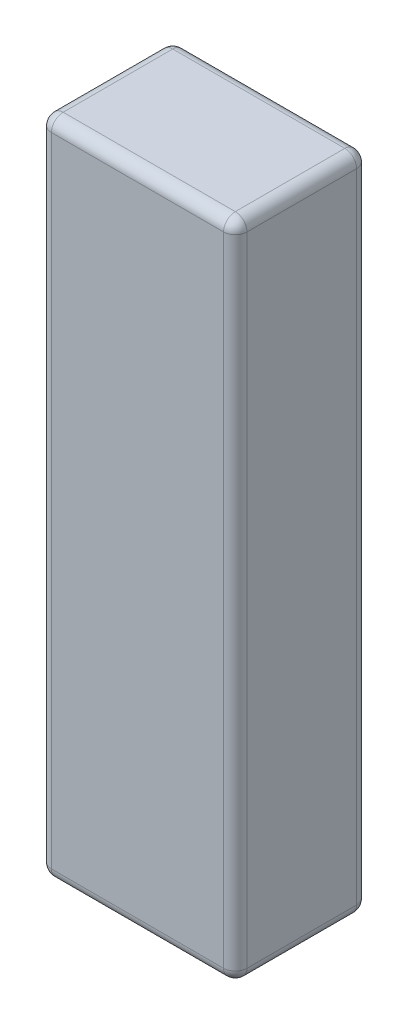
ISO-10303-21;
HEADER;
FILE_DESCRIPTION(('STEP AP214'),'2;1');
FILE_NAME('part.step','',(''),(''),'','','');
FILE_SCHEMA(('AUTOMOTIVE_DESIGN { 1 0 10303 214 1 1 1 1 }'));
ENDSEC;
DATA;
#1=APPLICATION_CONTEXT('core data for automotive mechanical design processes');
#2=APPLICATION_PROTOCOL_DEFINITION('international standard','automotive_design',2000,#1);
#3=PRODUCT_CONTEXT('',#1,'mechanical');
#4=PRODUCT('Part','Part','',(#3));
#5=PRODUCT_RELATED_PRODUCT_CATEGORY('part','',(#4));
#6=PRODUCT_DEFINITION_FORMATION('','',#4);
#7=PRODUCT_DEFINITION_CONTEXT('part definition',#1,'design');
#8=PRODUCT_DEFINITION('design','',#6,#7);
#9=PRODUCT_DEFINITION_SHAPE('','',#8);
#10=(LENGTH_UNIT() NAMED_UNIT(*) SI_UNIT(.MILLI.,.METRE.));
#11=(NAMED_UNIT(*) PLANE_ANGLE_UNIT() SI_UNIT($,.RADIAN.));
#12=(NAMED_UNIT(*) SI_UNIT($,.STERADIAN.) SOLID_ANGLE_UNIT());
#13=UNCERTAINTY_MEASURE_WITH_UNIT(LENGTH_MEASURE(1.E-05),#10,'distance_accuracy_value','');
#14=(GEOMETRIC_REPRESENTATION_CONTEXT(3) GLOBAL_UNCERTAINTY_ASSIGNED_CONTEXT((#13)) GLOBAL_UNIT_ASSIGNED_CONTEXT((#10,
#11,#12)) REPRESENTATION_CONTEXT('',''));
#15=CARTESIAN_POINT('',(0.,0.,0.));
#16=DIRECTION('',(0.,0.,1.));
#17=DIRECTION('',(1.,0.,0.));
#18=AXIS2_PLACEMENT_3D('',#15,#16,#17);
#19=CARTESIAN_POINT('',(25.,-84.5,17.));
#20=DIRECTION('',(-1.,0.,0.));
#21=DIRECTION('',(0.,0.,1.));
#22=AXIS2_PLACEMENT_3D('',#19,#20,#21);
#23=PLANE('',#22);
#24=DIRECTION('',(0.,1.,0.));
#25=VECTOR('',#24,1.);
#26=CARTESIAN_POINT('',(25.,-84.5,14.));
#27=LINE('',#26,#25);
#28=CARTESIAN_POINT('',(25.,81.5,14.));
#29=VERTEX_POINT('',#28);
#30=CARTESIAN_POINT('',(25.,-81.5,14.));
#31=VERTEX_POINT('',#30);
#32=EDGE_CURVE('E143',#29,#31,#27,.F.);
#33=ORIENTED_EDGE('',*,*,#32,.T.);
#34=DIRECTION('',(0.,0.,-1.));
#35=VECTOR('',#34,1.);
#36=CARTESIAN_POINT('',(25.,-81.5,17.));
#37=LINE('',#36,#35);
#38=CARTESIAN_POINT('',(25.,-81.5,-14.));
#39=VERTEX_POINT('',#38);
#40=EDGE_CURVE('E194',#31,#39,#37,.T.);
#41=ORIENTED_EDGE('',*,*,#40,.T.);
#42=DIRECTION('',(0.,1.,0.));
#43=VECTOR('',#42,1.);
#44=CARTESIAN_POINT('',(25.,84.5,-14.));
#45=LINE('',#44,#43);
#46=CARTESIAN_POINT('',(25.,81.5,-14.));
#47=VERTEX_POINT('',#46);
#48=EDGE_CURVE('E189',#39,#47,#45,.T.);
#49=ORIENTED_EDGE('',*,*,#48,.T.);
#50=DIRECTION('',(0.,0.,-1.));
#51=VECTOR('',#50,1.);
#52=CARTESIAN_POINT('',(25.,81.5,17.));
#53=LINE('',#52,#51);
#54=EDGE_CURVE('E187',#47,#29,#53,.F.);
#55=ORIENTED_EDGE('',*,*,#54,.T.);
#56=EDGE_LOOP('',(#33,#41,#49,#55));
#57=FACE_BOUND('',#56,.T.);
#58=ADVANCED_FACE('F36',(#57),#23,.F.);
#59=CARTESIAN_POINT('',(-25.,84.5,17.));
#60=DIRECTION('',(0.,-1.,0.));
#61=DIRECTION('',(0.,0.,-1.));
#62=AXIS2_PLACEMENT_3D('',#59,#60,#61);
#63=PLANE('',#62);
#64=DIRECTION('',(-1.,0.,0.));
#65=VECTOR('',#64,1.);
#66=CARTESIAN_POINT('',(-25.,84.5,14.));
#67=LINE('',#66,#65);
#68=CARTESIAN_POINT('',(-22.,84.5,14.));
#69=VERTEX_POINT('',#68);
#70=CARTESIAN_POINT('',(22.,84.5,14.));
#71=VERTEX_POINT('',#70);
#72=EDGE_CURVE('E45',#69,#71,#67,.F.);
#73=ORIENTED_EDGE('',*,*,#72,.T.);
#74=DIRECTION('',(0.,0.,-1.));
#75=VECTOR('',#74,1.);
#76=CARTESIAN_POINT('',(22.,84.5,17.));
#77=LINE('',#76,#75);
#78=CARTESIAN_POINT('',(22.,84.5,-14.));
#79=VERTEX_POINT('',#78);
#80=EDGE_CURVE('E11',#71,#79,#77,.T.);
#81=ORIENTED_EDGE('',*,*,#80,.T.);
#82=DIRECTION('',(-1.,0.,0.));
#83=VECTOR('',#82,1.);
#84=CARTESIAN_POINT('',(-25.,84.5,-14.));
#85=LINE('',#84,#83);
#86=CARTESIAN_POINT('',(-22.,84.5,-14.));
#87=VERTEX_POINT('',#86);
#88=EDGE_CURVE('E207',#79,#87,#85,.T.);
#89=ORIENTED_EDGE('',*,*,#88,.T.);
#90=DIRECTION('',(0.,0.,-1.));
#91=VECTOR('',#90,1.);
#92=CARTESIAN_POINT('',(-22.,84.5,17.));
#93=LINE('',#92,#91);
#94=EDGE_CURVE('E56',#87,#69,#93,.F.);
#95=ORIENTED_EDGE('',*,*,#94,.T.);
#96=EDGE_LOOP('',(#73,#81,#89,#95));
#97=FACE_BOUND('',#96,.T.);
#98=ADVANCED_FACE('F306',(#97),#63,.F.);
#99=CARTESIAN_POINT('',(-25.,-84.5,17.));
#100=DIRECTION('',(1.,0.,0.));
#101=DIRECTION('',(0.,0.,-1.));
#102=AXIS2_PLACEMENT_3D('',#99,#100,#101);
#103=PLANE('',#102);
#104=DIRECTION('',(0.,-1.,0.));
#105=VECTOR('',#104,1.);
#106=CARTESIAN_POINT('',(-25.,-84.5,-14.));
#107=LINE('',#106,#105);
#108=CARTESIAN_POINT('',(-25.,81.5,-14.));
#109=VERTEX_POINT('',#108);
#110=CARTESIAN_POINT('',(-25.,-81.5,-14.));
#111=VERTEX_POINT('',#110);
#112=EDGE_CURVE('E169',#109,#111,#107,.T.);
#113=ORIENTED_EDGE('',*,*,#112,.T.);
#114=DIRECTION('',(0.,0.,-1.));
#115=VECTOR('',#114,1.);
#116=CARTESIAN_POINT('',(-25.,-81.5,17.));
#117=LINE('',#116,#115);
#118=CARTESIAN_POINT('',(-25.,-81.5,14.));
#119=VERTEX_POINT('',#118);
#120=EDGE_CURVE('E174',#111,#119,#117,.F.);
#121=ORIENTED_EDGE('',*,*,#120,.T.);
#122=DIRECTION('',(0.,-1.,0.));
#123=VECTOR('',#122,1.);
#124=CARTESIAN_POINT('',(-25.,-84.5,14.));
#125=LINE('',#124,#123);
#126=CARTESIAN_POINT('',(-25.,81.5,14.));
#127=VERTEX_POINT('',#126);
#128=EDGE_CURVE('E171',#119,#127,#125,.F.);
#129=ORIENTED_EDGE('',*,*,#128,.T.);
#130=DIRECTION('',(0.,0.,-1.));
#131=VECTOR('',#130,1.);
#132=CARTESIAN_POINT('',(-25.,81.5,17.));
#133=LINE('',#132,#131);
#134=EDGE_CURVE('E167',#127,#109,#133,.T.);
#135=ORIENTED_EDGE('',*,*,#134,.T.);
#136=EDGE_LOOP('',(#113,#121,#129,#135));
#137=FACE_BOUND('',#136,.T.);
#138=ADVANCED_FACE('F311',(#137),#103,.F.);
#139=CARTESIAN_POINT('',(-25.,-84.5,17.));
#140=DIRECTION('',(0.,1.,0.));
#141=DIRECTION('',(0.,0.,1.));
#142=AXIS2_PLACEMENT_3D('',#139,#140,#141);
#143=PLANE('',#142);
#144=DIRECTION('',(1.,0.,0.));
#145=VECTOR('',#144,1.);
#146=CARTESIAN_POINT('',(-25.,-84.5,14.));
#147=LINE('',#146,#145);
#148=CARTESIAN_POINT('',(22.,-84.5,14.));
#149=VERTEX_POINT('',#148);
#150=CARTESIAN_POINT('',(-22.,-84.5,14.));
#151=VERTEX_POINT('',#150);
#152=EDGE_CURVE('E201',#149,#151,#147,.F.);
#153=ORIENTED_EDGE('',*,*,#152,.T.);
#154=DIRECTION('',(0.,0.,-1.));
#155=VECTOR('',#154,1.);
#156=CARTESIAN_POINT('',(-22.,-84.5,17.));
#157=LINE('',#156,#155);
#158=CARTESIAN_POINT('',(-22.,-84.5,-14.));
#159=VERTEX_POINT('',#158);
#160=EDGE_CURVE('E204',#151,#159,#157,.T.);
#161=ORIENTED_EDGE('',*,*,#160,.T.);
#162=DIRECTION('',(1.,0.,0.));
#163=VECTOR('',#162,1.);
#164=CARTESIAN_POINT('',(25.,-84.5,-14.));
#165=LINE('',#164,#163);
#166=CARTESIAN_POINT('',(22.,-84.5,-14.));
#167=VERTEX_POINT('',#166);
#168=EDGE_CURVE('E196',#159,#167,#165,.T.);
#169=ORIENTED_EDGE('',*,*,#168,.T.);
#170=DIRECTION('',(0.,0.,-1.));
#171=VECTOR('',#170,1.);
#172=CARTESIAN_POINT('',(22.,-84.5,17.));
#173=LINE('',#172,#171);
#174=EDGE_CURVE('E199',#167,#149,#173,.F.);
#175=ORIENTED_EDGE('',*,*,#174,.T.);
#176=EDGE_LOOP('',(#153,#161,#169,#175));
#177=FACE_BOUND('',#176,.T.);
#178=ADVANCED_FACE('F274',(#177),#143,.F.);
#179=CARTESIAN_POINT('',(0.,0.,17.));
#180=DIRECTION('',(0.,0.,-1.));
#181=DIRECTION('',(-1.,0.,0.));
#182=AXIS2_PLACEMENT_3D('',#179,#180,#181);
#183=PLANE('',#182);
#184=DIRECTION('',(0.,-1.,0.));
#185=VECTOR('',#184,1.);
#186=CARTESIAN_POINT('',(-22.,0.,17.));
#187=LINE('',#186,#185);
#188=CARTESIAN_POINT('',(-22.,81.5,17.));
#189=VERTEX_POINT('',#188);
#190=CARTESIAN_POINT('',(-22.,-81.5,17.));
#191=VERTEX_POINT('',#190);
#192=EDGE_CURVE('E135',#189,#191,#187,.T.);
#193=ORIENTED_EDGE('',*,*,#192,.T.);
#194=DIRECTION('',(1.,0.,0.));
#195=VECTOR('',#194,1.);
#196=CARTESIAN_POINT('',(0.,-81.5,17.));
#197=LINE('',#196,#195);
#198=CARTESIAN_POINT('',(22.,-81.5,17.));
#199=VERTEX_POINT('',#198);
#200=EDGE_CURVE('E131',#191,#199,#197,.T.);
#201=ORIENTED_EDGE('',*,*,#200,.T.);
#202=DIRECTION('',(0.,1.,0.));
#203=VECTOR('',#202,1.);
#204=CARTESIAN_POINT('',(22.,0.,17.));
#205=LINE('',#204,#203);
#206=CARTESIAN_POINT('',(22.,81.5,17.));
#207=VERTEX_POINT('',#206);
#208=EDGE_CURVE('E123',#199,#207,#205,.T.);
#209=ORIENTED_EDGE('',*,*,#208,.T.);
#210=DIRECTION('',(-1.,0.,0.));
#211=VECTOR('',#210,1.);
#212=CARTESIAN_POINT('',(0.,81.5,17.));
#213=LINE('',#212,#211);
#214=EDGE_CURVE('E128',#207,#189,#213,.T.);
#215=ORIENTED_EDGE('',*,*,#214,.T.);
#216=EDGE_LOOP('',(#193,#201,#209,#215));
#217=FACE_BOUND('',#216,.T.);
#218=ADVANCED_FACE('F126',(#217),#183,.F.);
#219=CARTESIAN_POINT('',(0.,0.,-17.));
#220=DIRECTION('',(0.,0.,-1.));
#221=DIRECTION('',(-1.,0.,0.));
#222=AXIS2_PLACEMENT_3D('',#219,#220,#221);
#223=PLANE('',#222);
#224=DIRECTION('',(0.,1.,0.));
#225=VECTOR('',#224,1.);
#226=CARTESIAN_POINT('',(22.,-84.5,-17.));
#227=LINE('',#226,#225);
#228=CARTESIAN_POINT('',(22.,81.5,-17.));
#229=VERTEX_POINT('',#228);
#230=CARTESIAN_POINT('',(22.,-81.5,-17.));
#231=VERTEX_POINT('',#230);
#232=EDGE_CURVE('E178',#229,#231,#227,.F.);
#233=ORIENTED_EDGE('',*,*,#232,.T.);
#234=DIRECTION('',(1.,0.,0.));
#235=VECTOR('',#234,1.);
#236=CARTESIAN_POINT('',(-25.,-81.5,-17.));
#237=LINE('',#236,#235);
#238=CARTESIAN_POINT('',(-22.,-81.5,-17.));
#239=VERTEX_POINT('',#238);
#240=EDGE_CURVE('E185',#231,#239,#237,.F.);
#241=ORIENTED_EDGE('',*,*,#240,.T.);
#242=DIRECTION('',(0.,-1.,0.));
#243=VECTOR('',#242,1.);
#244=CARTESIAN_POINT('',(-22.,84.5,-17.));
#245=LINE('',#244,#243);
#246=CARTESIAN_POINT('',(-22.,81.5,-17.));
#247=VERTEX_POINT('',#246);
#248=EDGE_CURVE('E181',#239,#247,#245,.F.);
#249=ORIENTED_EDGE('',*,*,#248,.T.);
#250=DIRECTION('',(-1.,0.,0.));
#251=VECTOR('',#250,1.);
#252=CARTESIAN_POINT('',(25.,81.5,-17.));
#253=LINE('',#252,#251);
#254=EDGE_CURVE('E176',#247,#229,#253,.F.);
#255=ORIENTED_EDGE('',*,*,#254,.T.);
#256=EDGE_LOOP('',(#233,#241,#249,#255));
#257=FACE_BOUND('',#256,.T.);
#258=ADVANCED_FACE('F283',(#257),#223,.T.);
#259=CARTESIAN_POINT('',(22.,-84.5,-14.));
#260=DIRECTION('',(0.,-1.,0.));
#261=DIRECTION('',(0.,0.,-1.));
#262=AXIS2_PLACEMENT_3D('',#259,#260,#261);
#263=CYLINDRICAL_SURFACE('',#262,3.);
#264=CARTESIAN_POINT('',(22.,81.5,-14.));
#265=DIRECTION('',(0.,1.,0.));
#266=DIRECTION('',(0.,0.,1.));
#267=AXIS2_PLACEMENT_3D('',#264,#265,#266);
#268=CIRCLE('',#267,3.);
#269=EDGE_CURVE('E40',#47,#229,#268,.T.);
#270=ORIENTED_EDGE('',*,*,#269,.F.);
#271=ORIENTED_EDGE('',*,*,#48,.F.);
#272=CARTESIAN_POINT('',(22.,-81.5,-14.));
#273=DIRECTION('',(0.,-1.,0.));
#274=DIRECTION('',(0.,0.,-1.));
#275=AXIS2_PLACEMENT_3D('',#272,#273,#274);
#276=CIRCLE('',#275,3.);
#277=EDGE_CURVE('E163',#231,#39,#276,.T.);
#278=ORIENTED_EDGE('',*,*,#277,.F.);
#279=ORIENTED_EDGE('',*,*,#232,.F.);
#280=EDGE_LOOP('',(#270,#271,#278,#279));
#281=FACE_BOUND('',#280,.T.);
#282=ADVANCED_FACE('F38',(#281),#263,.T.);
#283=CARTESIAN_POINT('',(22.,81.5,-14.));
#284=DIRECTION('',(0.,0.,1.));
#285=DIRECTION('',(1.,0.,0.));
#286=AXIS2_PLACEMENT_3D('',#283,#284,#285);
#287=SPHERICAL_SURFACE('',#286,3.);
#288=CARTESIAN_POINT('',(22.,81.5,-14.));
#289=DIRECTION('',(0.,0.,-1.));
#290=DIRECTION('',(-1.,0.,0.));
#291=AXIS2_PLACEMENT_3D('',#288,#289,#290);
#292=CIRCLE('',#291,3.);
#293=EDGE_CURVE('E252',#47,#79,#292,.F.);
#294=ORIENTED_EDGE('',*,*,#293,.F.);
#295=ORIENTED_EDGE('',*,*,#269,.T.);
#296=CARTESIAN_POINT('',(22.,81.5,-14.));
#297=DIRECTION('',(1.,0.,0.));
#298=DIRECTION('',(0.,1.,0.));
#299=AXIS2_PLACEMENT_3D('',#296,#297,#298);
#300=CIRCLE('',#299,3.);
#301=EDGE_CURVE('E255',#79,#229,#300,.F.);
#302=ORIENTED_EDGE('',*,*,#301,.F.);
#303=EDGE_LOOP('',(#294,#295,#302));
#304=FACE_BOUND('',#303,.T.);
#305=ADVANCED_FACE('F300',(#304),#287,.T.);
#306=CARTESIAN_POINT('',(22.,-81.5,-14.));
#307=DIRECTION('',(0.,0.,1.));
#308=DIRECTION('',(1.,0.,0.));
#309=AXIS2_PLACEMENT_3D('',#306,#307,#308);
#310=SPHERICAL_SURFACE('',#309,3.);
#311=CARTESIAN_POINT('',(22.,-81.5,-14.));
#312=DIRECTION('',(1.,0.,0.));
#313=DIRECTION('',(0.,0.,-1.));
#314=AXIS2_PLACEMENT_3D('',#311,#312,#313);
#315=CIRCLE('',#314,3.);
#316=EDGE_CURVE('E246',#231,#167,#315,.F.);
#317=ORIENTED_EDGE('',*,*,#316,.F.);
#318=ORIENTED_EDGE('',*,*,#277,.T.);
#319=CARTESIAN_POINT('',(22.,-81.5,-14.));
#320=DIRECTION('',(0.,0.,-1.));
#321=DIRECTION('',(-1.,0.,0.));
#322=AXIS2_PLACEMENT_3D('',#319,#320,#321);
#323=CIRCLE('',#322,3.);
#324=EDGE_CURVE('E249',#167,#39,#323,.F.);
#325=ORIENTED_EDGE('',*,*,#324,.F.);
#326=EDGE_LOOP('',(#317,#318,#325));
#327=FACE_BOUND('',#326,.T.);
#328=ADVANCED_FACE('F262',(#327),#310,.T.);
#329=CARTESIAN_POINT('',(-25.,81.5,-14.));
#330=DIRECTION('',(1.,0.,0.));
#331=DIRECTION('',(0.,0.,-1.));
#332=AXIS2_PLACEMENT_3D('',#329,#330,#331);
#333=CYLINDRICAL_SURFACE('',#332,3.);
#334=ORIENTED_EDGE('',*,*,#301,.T.);
#335=ORIENTED_EDGE('',*,*,#254,.F.);
#336=CARTESIAN_POINT('',(-22.,81.5,-14.));
#337=DIRECTION('',(-1.,0.,0.));
#338=DIRECTION('',(0.,0.,1.));
#339=AXIS2_PLACEMENT_3D('',#336,#337,#338);
#340=CIRCLE('',#339,3.);
#341=EDGE_CURVE('E241',#87,#247,#340,.T.);
#342=ORIENTED_EDGE('',*,*,#341,.F.);
#343=ORIENTED_EDGE('',*,*,#88,.F.);
#344=EDGE_LOOP('',(#334,#335,#342,#343));
#345=FACE_BOUND('',#344,.T.);
#346=ADVANCED_FACE('F295',(#345),#333,.T.);
#347=CARTESIAN_POINT('',(22.,81.5,17.));
#348=DIRECTION('',(0.,0.,-1.));
#349=DIRECTION('',(-1.,0.,0.));
#350=AXIS2_PLACEMENT_3D('',#347,#348,#349);
#351=CYLINDRICAL_SURFACE('',#350,3.);
#352=ORIENTED_EDGE('',*,*,#293,.T.);
#353=ORIENTED_EDGE('',*,*,#80,.F.);
#354=CARTESIAN_POINT('',(22.,81.5,14.));
#355=DIRECTION('',(0.,0.,1.));
#356=DIRECTION('',(1.,0.,0.));
#357=AXIS2_PLACEMENT_3D('',#354,#355,#356);
#358=CIRCLE('',#357,3.);
#359=EDGE_CURVE('E147',#29,#71,#358,.T.);
#360=ORIENTED_EDGE('',*,*,#359,.F.);
#361=ORIENTED_EDGE('',*,*,#54,.F.);
#362=EDGE_LOOP('',(#352,#353,#360,#361));
#363=FACE_BOUND('',#362,.T.);
#364=ADVANCED_FACE('F303',(#363),#351,.T.);
#365=CARTESIAN_POINT('',(22.,0.,14.));
#366=DIRECTION('',(0.,1.,0.));
#367=DIRECTION('',(0.,0.,1.));
#368=AXIS2_PLACEMENT_3D('',#365,#366,#367);
#369=CYLINDRICAL_SURFACE('',#368,3.);
#370=CARTESIAN_POINT('',(22.,-81.5,14.));
#371=DIRECTION('',(0.,-1.,0.));
#372=DIRECTION('',(0.,0.,-1.));
#373=AXIS2_PLACEMENT_3D('',#370,#371,#372);
#374=CIRCLE('',#373,3.);
#375=EDGE_CURVE('E148',#31,#199,#374,.T.);
#376=ORIENTED_EDGE('',*,*,#375,.F.);
#377=ORIENTED_EDGE('',*,*,#32,.F.);
#378=CARTESIAN_POINT('',(22.,81.5,14.));
#379=DIRECTION('',(0.,1.,0.));
#380=DIRECTION('',(0.,0.,1.));
#381=AXIS2_PLACEMENT_3D('',#378,#379,#380);
#382=CIRCLE('',#381,3.);
#383=EDGE_CURVE('E139',#207,#29,#382,.T.);
#384=ORIENTED_EDGE('',*,*,#383,.F.);
#385=ORIENTED_EDGE('',*,*,#208,.F.);
#386=EDGE_LOOP('',(#376,#377,#384,#385));
#387=FACE_BOUND('',#386,.T.);
#388=ADVANCED_FACE('F141',(#387),#369,.T.);
#389=CARTESIAN_POINT('',(22.,-81.5,17.));
#390=DIRECTION('',(0.,0.,-1.));
#391=DIRECTION('',(-1.,0.,0.));
#392=AXIS2_PLACEMENT_3D('',#389,#390,#391);
#393=CYLINDRICAL_SURFACE('',#392,3.);
#394=ORIENTED_EDGE('',*,*,#324,.T.);
#395=ORIENTED_EDGE('',*,*,#40,.F.);
#396=CARTESIAN_POINT('',(22.,-81.5,14.));
#397=DIRECTION('',(0.,0.,1.));
#398=DIRECTION('',(1.,0.,0.));
#399=AXIS2_PLACEMENT_3D('',#396,#397,#398);
#400=CIRCLE('',#399,3.);
#401=EDGE_CURVE('E237',#149,#31,#400,.T.);
#402=ORIENTED_EDGE('',*,*,#401,.F.);
#403=ORIENTED_EDGE('',*,*,#174,.F.);
#404=EDGE_LOOP('',(#394,#395,#402,#403));
#405=FACE_BOUND('',#404,.T.);
#406=ADVANCED_FACE('F270',(#405),#393,.T.);
#407=CARTESIAN_POINT('',(-25.,-81.5,-14.));
#408=DIRECTION('',(-1.,0.,0.));
#409=DIRECTION('',(0.,0.,1.));
#410=AXIS2_PLACEMENT_3D('',#407,#408,#409);
#411=CYLINDRICAL_SURFACE('',#410,3.);
#412=ORIENTED_EDGE('',*,*,#316,.T.);
#413=ORIENTED_EDGE('',*,*,#168,.F.);
#414=CARTESIAN_POINT('',(-22.,-81.5,-14.));
#415=DIRECTION('',(-1.,0.,0.));
#416=DIRECTION('',(0.,0.,1.));
#417=AXIS2_PLACEMENT_3D('',#414,#415,#416);
#418=CIRCLE('',#417,3.);
#419=EDGE_CURVE('E234',#239,#159,#418,.T.);
#420=ORIENTED_EDGE('',*,*,#419,.F.);
#421=ORIENTED_EDGE('',*,*,#240,.F.);
#422=EDGE_LOOP('',(#412,#413,#420,#421));
#423=FACE_BOUND('',#422,.T.);
#424=ADVANCED_FACE('F280',(#423),#411,.T.);
#425=CARTESIAN_POINT('',(-22.,-84.5,-14.));
#426=DIRECTION('',(0.,1.,0.));
#427=DIRECTION('',(0.,0.,1.));
#428=AXIS2_PLACEMENT_3D('',#425,#426,#427);
#429=CYLINDRICAL_SURFACE('',#428,3.);
#430=CARTESIAN_POINT('',(-22.,81.5,-14.));
#431=DIRECTION('',(0.,1.,0.));
#432=DIRECTION('',(0.,0.,1.));
#433=AXIS2_PLACEMENT_3D('',#430,#431,#432);
#434=CIRCLE('',#433,3.);
#435=EDGE_CURVE('E243',#247,#109,#434,.T.);
#436=ORIENTED_EDGE('',*,*,#435,.F.);
#437=ORIENTED_EDGE('',*,*,#248,.F.);
#438=CARTESIAN_POINT('',(-22.,-81.5,-14.));
#439=DIRECTION('',(0.,-1.,0.));
#440=DIRECTION('',(0.,0.,-1.));
#441=AXIS2_PLACEMENT_3D('',#438,#439,#440);
#442=CIRCLE('',#441,3.);
#443=EDGE_CURVE('E231',#111,#239,#442,.T.);
#444=ORIENTED_EDGE('',*,*,#443,.F.);
#445=ORIENTED_EDGE('',*,*,#112,.F.);
#446=EDGE_LOOP('',(#436,#437,#444,#445));
#447=FACE_BOUND('',#446,.T.);
#448=ADVANCED_FACE('F287',(#447),#429,.T.);
#449=CARTESIAN_POINT('',(-22.,81.5,-14.));
#450=DIRECTION('',(0.,0.,1.));
#451=DIRECTION('',(1.,0.,0.));
#452=AXIS2_PLACEMENT_3D('',#449,#450,#451);
#453=SPHERICAL_SURFACE('',#452,3.);
#454=ORIENTED_EDGE('',*,*,#341,.T.);
#455=ORIENTED_EDGE('',*,*,#435,.T.);
#456=CARTESIAN_POINT('',(-22.,81.5,-14.));
#457=DIRECTION('',(0.,0.,-1.));
#458=DIRECTION('',(-1.,0.,0.));
#459=AXIS2_PLACEMENT_3D('',#456,#457,#458);
#460=CIRCLE('',#459,3.);
#461=EDGE_CURVE('E154',#87,#109,#460,.F.);
#462=ORIENTED_EDGE('',*,*,#461,.F.);
#463=EDGE_LOOP('',(#454,#455,#462));
#464=FACE_BOUND('',#463,.T.);
#465=ADVANCED_FACE('F351',(#464),#453,.T.);
#466=CARTESIAN_POINT('',(22.,81.5,14.));
#467=DIRECTION('',(0.,0.,1.));
#468=DIRECTION('',(1.,0.,0.));
#469=AXIS2_PLACEMENT_3D('',#466,#467,#468);
#470=SPHERICAL_SURFACE('',#469,3.);
#471=ORIENTED_EDGE('',*,*,#383,.T.);
#472=ORIENTED_EDGE('',*,*,#359,.T.);
#473=CARTESIAN_POINT('',(22.,81.5,14.));
#474=DIRECTION('',(1.,0.,0.));
#475=DIRECTION('',(0.,0.,-1.));
#476=AXIS2_PLACEMENT_3D('',#473,#474,#475);
#477=CIRCLE('',#476,3.);
#478=EDGE_CURVE('E151',#207,#71,#477,.F.);
#479=ORIENTED_EDGE('',*,*,#478,.F.);
#480=EDGE_LOOP('',(#471,#472,#479));
#481=FACE_BOUND('',#480,.T.);
#482=ADVANCED_FACE('F152',(#481),#470,.T.);
#483=CARTESIAN_POINT('',(22.,-81.5,14.));
#484=DIRECTION('',(0.,0.,1.));
#485=DIRECTION('',(1.,0.,0.));
#486=AXIS2_PLACEMENT_3D('',#483,#484,#485);
#487=SPHERICAL_SURFACE('',#486,3.);
#488=ORIENTED_EDGE('',*,*,#401,.T.);
#489=ORIENTED_EDGE('',*,*,#375,.T.);
#490=CARTESIAN_POINT('',(22.,-81.5,14.));
#491=DIRECTION('',(1.,0.,0.));
#492=DIRECTION('',(0.,0.,-1.));
#493=AXIS2_PLACEMENT_3D('',#490,#491,#492);
#494=CIRCLE('',#493,3.);
#495=EDGE_CURVE('E155',#149,#199,#494,.F.);
#496=ORIENTED_EDGE('',*,*,#495,.F.);
#497=EDGE_LOOP('',(#488,#489,#496));
#498=FACE_BOUND('',#497,.T.);
#499=ADVANCED_FACE('F344',(#498),#487,.T.);
#500=CARTESIAN_POINT('',(-22.,-81.5,-14.));
#501=DIRECTION('',(0.,0.,1.));
#502=DIRECTION('',(1.,0.,0.));
#503=AXIS2_PLACEMENT_3D('',#500,#501,#502);
#504=SPHERICAL_SURFACE('',#503,3.);
#505=ORIENTED_EDGE('',*,*,#443,.T.);
#506=ORIENTED_EDGE('',*,*,#419,.T.);
#507=CARTESIAN_POINT('',(-22.,-81.5,-14.));
#508=DIRECTION('',(0.,0.,-1.));
#509=DIRECTION('',(-1.,0.,0.));
#510=AXIS2_PLACEMENT_3D('',#507,#508,#509);
#511=CIRCLE('',#510,3.);
#512=EDGE_CURVE('E225',#111,#159,#511,.F.);
#513=ORIENTED_EDGE('',*,*,#512,.F.);
#514=EDGE_LOOP('',(#505,#506,#513));
#515=FACE_BOUND('',#514,.T.);
#516=ADVANCED_FACE('F340',(#515),#504,.T.);
#517=CARTESIAN_POINT('',(-22.,81.5,17.));
#518=DIRECTION('',(0.,0.,-1.));
#519=DIRECTION('',(-1.,0.,0.));
#520=AXIS2_PLACEMENT_3D('',#517,#518,#519);
#521=CYLINDRICAL_SURFACE('',#520,3.);
#522=ORIENTED_EDGE('',*,*,#461,.T.);
#523=ORIENTED_EDGE('',*,*,#134,.F.);
#524=CARTESIAN_POINT('',(-22.,81.5,14.));
#525=DIRECTION('',(0.,0.,1.));
#526=DIRECTION('',(1.,0.,0.));
#527=AXIS2_PLACEMENT_3D('',#524,#525,#526);
#528=CIRCLE('',#527,3.);
#529=EDGE_CURVE('E222',#69,#127,#528,.T.);
#530=ORIENTED_EDGE('',*,*,#529,.F.);
#531=ORIENTED_EDGE('',*,*,#94,.F.);
#532=EDGE_LOOP('',(#522,#523,#530,#531));
#533=FACE_BOUND('',#532,.T.);
#534=ADVANCED_FACE('F337',(#533),#521,.T.);
#535=CARTESIAN_POINT('',(0.,81.5,14.));
#536=DIRECTION('',(-1.,0.,0.));
#537=DIRECTION('',(0.,0.,1.));
#538=AXIS2_PLACEMENT_3D('',#535,#536,#537);
#539=CYLINDRICAL_SURFACE('',#538,3.);
#540=ORIENTED_EDGE('',*,*,#478,.T.);
#541=ORIENTED_EDGE('',*,*,#72,.F.);
#542=CARTESIAN_POINT('',(-22.,81.5,14.));
#543=DIRECTION('',(-1.,0.,0.));
#544=DIRECTION('',(0.,0.,1.));
#545=AXIS2_PLACEMENT_3D('',#542,#543,#544);
#546=CIRCLE('',#545,3.);
#547=EDGE_CURVE('E159',#189,#69,#546,.T.);
#548=ORIENTED_EDGE('',*,*,#547,.F.);
#549=ORIENTED_EDGE('',*,*,#214,.F.);
#550=EDGE_LOOP('',(#540,#541,#548,#549));
#551=FACE_BOUND('',#550,.T.);
#552=ADVANCED_FACE('F157',(#551),#539,.T.);
#553=CARTESIAN_POINT('',(0.,-81.5,14.));
#554=DIRECTION('',(1.,0.,0.));
#555=DIRECTION('',(0.,0.,-1.));
#556=AXIS2_PLACEMENT_3D('',#553,#554,#555);
#557=CYLINDRICAL_SURFACE('',#556,3.);
#558=ORIENTED_EDGE('',*,*,#495,.T.);
#559=ORIENTED_EDGE('',*,*,#200,.F.);
#560=CARTESIAN_POINT('',(-22.,-81.5,14.));
#561=DIRECTION('',(-1.,0.,0.));
#562=DIRECTION('',(0.,0.,1.));
#563=AXIS2_PLACEMENT_3D('',#560,#561,#562);
#564=CIRCLE('',#563,3.);
#565=EDGE_CURVE('E218',#151,#191,#564,.T.);
#566=ORIENTED_EDGE('',*,*,#565,.F.);
#567=ORIENTED_EDGE('',*,*,#152,.F.);
#568=EDGE_LOOP('',(#558,#559,#566,#567));
#569=FACE_BOUND('',#568,.T.);
#570=ADVANCED_FACE('F330',(#569),#557,.T.);
#571=CARTESIAN_POINT('',(-22.,-81.5,17.));
#572=DIRECTION('',(0.,0.,-1.));
#573=DIRECTION('',(-1.,0.,0.));
#574=AXIS2_PLACEMENT_3D('',#571,#572,#573);
#575=CYLINDRICAL_SURFACE('',#574,3.);
#576=ORIENTED_EDGE('',*,*,#512,.T.);
#577=ORIENTED_EDGE('',*,*,#160,.F.);
#578=CARTESIAN_POINT('',(-22.,-81.5,14.));
#579=DIRECTION('',(0.,0.,1.));
#580=DIRECTION('',(1.,0.,0.));
#581=AXIS2_PLACEMENT_3D('',#578,#579,#580);
#582=CIRCLE('',#581,3.);
#583=EDGE_CURVE('E215',#119,#151,#582,.T.);
#584=ORIENTED_EDGE('',*,*,#583,.F.);
#585=ORIENTED_EDGE('',*,*,#120,.F.);
#586=EDGE_LOOP('',(#576,#577,#584,#585));
#587=FACE_BOUND('',#586,.T.);
#588=ADVANCED_FACE('F326',(#587),#575,.T.);
#589=CARTESIAN_POINT('',(-22.,81.5,14.));
#590=DIRECTION('',(0.,0.,1.));
#591=DIRECTION('',(1.,0.,0.));
#592=AXIS2_PLACEMENT_3D('',#589,#590,#591);
#593=SPHERICAL_SURFACE('',#592,3.);
#594=ORIENTED_EDGE('',*,*,#547,.T.);
#595=ORIENTED_EDGE('',*,*,#529,.T.);
#596=CARTESIAN_POINT('',(-22.,81.5,14.));
#597=DIRECTION('',(0.,1.,0.));
#598=DIRECTION('',(0.,0.,1.));
#599=AXIS2_PLACEMENT_3D('',#596,#597,#598);
#600=CIRCLE('',#599,3.);
#601=EDGE_CURVE('E213',#189,#127,#600,.F.);
#602=ORIENTED_EDGE('',*,*,#601,.F.);
#603=EDGE_LOOP('',(#594,#595,#602));
#604=FACE_BOUND('',#603,.T.);
#605=ADVANCED_FACE('F322',(#604),#593,.T.);
#606=CARTESIAN_POINT('',(-22.,-81.5,14.));
#607=DIRECTION('',(0.,0.,1.));
#608=DIRECTION('',(1.,0.,0.));
#609=AXIS2_PLACEMENT_3D('',#606,#607,#608);
#610=SPHERICAL_SURFACE('',#609,3.);
#611=ORIENTED_EDGE('',*,*,#583,.T.);
#612=ORIENTED_EDGE('',*,*,#565,.T.);
#613=CARTESIAN_POINT('',(-22.,-81.5,14.));
#614=DIRECTION('',(0.,-1.,0.));
#615=DIRECTION('',(0.,0.,-1.));
#616=AXIS2_PLACEMENT_3D('',#613,#614,#615);
#617=CIRCLE('',#616,3.);
#618=EDGE_CURVE('E211',#119,#191,#617,.F.);
#619=ORIENTED_EDGE('',*,*,#618,.F.);
#620=EDGE_LOOP('',(#611,#612,#619));
#621=FACE_BOUND('',#620,.T.);
#622=ADVANCED_FACE('F318',(#621),#610,.T.);
#623=CARTESIAN_POINT('',(-22.,0.,14.));
#624=DIRECTION('',(0.,-1.,0.));
#625=DIRECTION('',(0.,0.,-1.));
#626=AXIS2_PLACEMENT_3D('',#623,#624,#625);
#627=CYLINDRICAL_SURFACE('',#626,3.);
#628=ORIENTED_EDGE('',*,*,#601,.T.);
#629=ORIENTED_EDGE('',*,*,#128,.F.);
#630=ORIENTED_EDGE('',*,*,#618,.T.);
#631=ORIENTED_EDGE('',*,*,#192,.F.);
#632=EDGE_LOOP('',(#628,#629,#630,#631));
#633=FACE_BOUND('',#632,.T.);
#634=ADVANCED_FACE('F315',(#633),#627,.T.);
#635=CLOSED_SHELL('',(#58,#98,#138,#178,#218,#258,#282,#305,#328,#346,#364,#388,#406,#424,#448,
#465,#482,#499,#516,#534,#552,#570,#588,#605,#622,#634));
#636=MANIFOLD_SOLID_BREP('B2',#635);
#637=ADVANCED_BREP_SHAPE_REPRESENTATION('',(#18,#636),#14);
#638=SHAPE_DEFINITION_REPRESENTATION(#9,#637);
ENDSEC;
END-ISO-10303-21;
